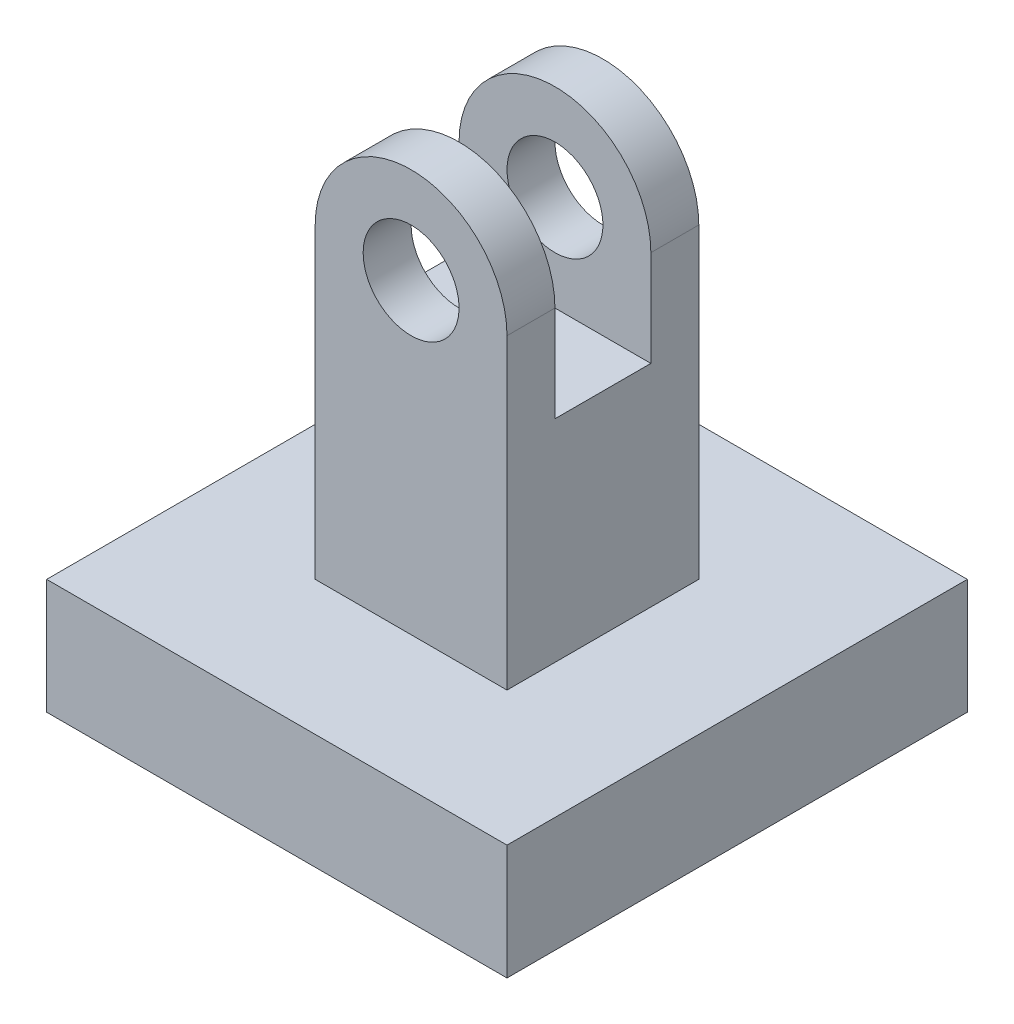
ISO-10303-21;
HEADER;
FILE_DESCRIPTION(('STEP AP214'),'2;1');
FILE_NAME('part.step','',(''),(''),'','','');
FILE_SCHEMA(('AUTOMOTIVE_DESIGN { 1 0 10303 214 1 1 1 1 }'));
ENDSEC;
DATA;
#1=APPLICATION_CONTEXT('core data for automotive mechanical design processes');
#2=APPLICATION_PROTOCOL_DEFINITION('international standard','automotive_design',2000,#1);
#3=PRODUCT_CONTEXT('',#1,'mechanical');
#4=PRODUCT('Part','Part','',(#3));
#5=PRODUCT_RELATED_PRODUCT_CATEGORY('part','',(#4));
#6=PRODUCT_DEFINITION_FORMATION('','',#4);
#7=PRODUCT_DEFINITION_CONTEXT('part definition',#1,'design');
#8=PRODUCT_DEFINITION('design','',#6,#7);
#9=PRODUCT_DEFINITION_SHAPE('','',#8);
#10=(LENGTH_UNIT() NAMED_UNIT(*) SI_UNIT(.MILLI.,.METRE.));
#11=(NAMED_UNIT(*) PLANE_ANGLE_UNIT() SI_UNIT($,.RADIAN.));
#12=(NAMED_UNIT(*) SI_UNIT($,.STERADIAN.) SOLID_ANGLE_UNIT());
#13=UNCERTAINTY_MEASURE_WITH_UNIT(LENGTH_MEASURE(1.E-05),#10,'distance_accuracy_value','');
#14=(GEOMETRIC_REPRESENTATION_CONTEXT(3) GLOBAL_UNCERTAINTY_ASSIGNED_CONTEXT((#13)) GLOBAL_UNIT_ASSIGNED_CONTEXT((#10,
#11,#12)) REPRESENTATION_CONTEXT('',''));
#15=CARTESIAN_POINT('',(0.,0.,0.));
#16=DIRECTION('',(0.,0.,1.));
#17=DIRECTION('',(1.,0.,0.));
#18=AXIS2_PLACEMENT_3D('',#15,#16,#17);
#19=CARTESIAN_POINT('',(-12.5,55.,0.));
#20=DIRECTION('',(-1.,0.,0.));
#21=DIRECTION('',(0.,0.,1.));
#22=AXIS2_PLACEMENT_3D('',#19,#20,#21);
#23=PLANE('',#22);
#24=DIRECTION('',(0.,0.,-1.));
#25=VECTOR('',#24,1.);
#26=CARTESIAN_POINT('',(-12.5,55.,0.));
#27=LINE('',#26,#25);
#28=CARTESIAN_POINT('',(-12.5,55.,12.5));
#29=VERTEX_POINT('',#28);
#30=CARTESIAN_POINT('',(-12.5,55.,6.25));
#31=VERTEX_POINT('',#30);
#32=EDGE_CURVE('E186',#29,#31,#27,.T.);
#33=ORIENTED_EDGE('',*,*,#32,.T.);
#34=DIRECTION('',(0.,-1.,0.));
#35=VECTOR('',#34,1.);
#36=CARTESIAN_POINT('',(-12.5,42.5,6.25));
#37=LINE('',#36,#35);
#38=CARTESIAN_POINT('',(-12.5,42.5,6.25));
#39=VERTEX_POINT('',#38);
#40=EDGE_CURVE('E163',#31,#39,#37,.T.);
#41=ORIENTED_EDGE('',*,*,#40,.T.);
#42=DIRECTION('',(0.,0.,-1.));
#43=VECTOR('',#42,1.);
#44=CARTESIAN_POINT('',(-12.5,42.5,6.25));
#45=LINE('',#44,#43);
#46=CARTESIAN_POINT('',(-12.5,42.5,-6.25));
#47=VERTEX_POINT('',#46);
#48=EDGE_CURVE('E154',#39,#47,#45,.T.);
#49=ORIENTED_EDGE('',*,*,#48,.T.);
#50=DIRECTION('',(0.,-1.,0.));
#51=VECTOR('',#50,1.);
#52=CARTESIAN_POINT('',(-12.5,42.5,-6.25));
#53=LINE('',#52,#51);
#54=CARTESIAN_POINT('',(-12.5,55.,-6.25));
#55=VERTEX_POINT('',#54);
#56=EDGE_CURVE('E140',#55,#47,#53,.T.);
#57=ORIENTED_EDGE('',*,*,#56,.F.);
#58=CARTESIAN_POINT('',(-12.5,55.,-12.5));
#59=VERTEX_POINT('',#58);
#60=EDGE_CURVE('E189',#55,#59,#27,.T.);
#61=ORIENTED_EDGE('',*,*,#60,.T.);
#62=DIRECTION('',(0.,-1.,0.));
#63=VECTOR('',#62,1.);
#64=CARTESIAN_POINT('',(-12.5,55.,-12.5));
#65=LINE('',#64,#63);
#66=CARTESIAN_POINT('',(-12.5,15.,-12.5));
#67=VERTEX_POINT('',#66);
#68=EDGE_CURVE('E193',#59,#67,#65,.T.);
#69=ORIENTED_EDGE('',*,*,#68,.T.);
#70=DIRECTION('',(0.,0.,-1.));
#71=VECTOR('',#70,1.);
#72=CARTESIAN_POINT('',(-12.5,15.,0.));
#73=LINE('',#72,#71);
#74=CARTESIAN_POINT('',(-12.5,15.,12.5));
#75=VERTEX_POINT('',#74);
#76=EDGE_CURVE('E56',#75,#67,#73,.T.);
#77=ORIENTED_EDGE('',*,*,#76,.F.);
#78=DIRECTION('',(0.,-1.,0.));
#79=VECTOR('',#78,1.);
#80=CARTESIAN_POINT('',(-12.5,55.,12.5));
#81=LINE('',#80,#79);
#82=EDGE_CURVE('E204',#29,#75,#81,.T.);
#83=ORIENTED_EDGE('',*,*,#82,.F.);
#84=EDGE_LOOP('',(#33,#41,#49,#57,#61,#69,#77,#83));
#85=FACE_BOUND('',#84,.T.);
#86=ADVANCED_FACE('F39',(#85),#23,.T.);
#87=CARTESIAN_POINT('',(12.5,55.,0.));
#88=DIRECTION('',(1.,0.,0.));
#89=DIRECTION('',(0.,0.,-1.));
#90=AXIS2_PLACEMENT_3D('',#87,#88,#89);
#91=PLANE('',#90);
#92=DIRECTION('',(0.,0.,-1.));
#93=VECTOR('',#92,1.);
#94=CARTESIAN_POINT('',(12.5,42.5,6.25));
#95=LINE('',#94,#93);
#96=CARTESIAN_POINT('',(12.5,42.5,6.25));
#97=VERTEX_POINT('',#96);
#98=CARTESIAN_POINT('',(12.5,42.5,-6.25));
#99=VERTEX_POINT('',#98);
#100=EDGE_CURVE('E157',#97,#99,#95,.T.);
#101=ORIENTED_EDGE('',*,*,#100,.F.);
#102=DIRECTION('',(0.,1.,0.));
#103=VECTOR('',#102,1.);
#104=CARTESIAN_POINT('',(12.5,42.5,6.25));
#105=LINE('',#104,#103);
#106=CARTESIAN_POINT('',(12.5,55.,6.25));
#107=VERTEX_POINT('',#106);
#108=EDGE_CURVE('E158',#97,#107,#105,.T.);
#109=ORIENTED_EDGE('',*,*,#108,.T.);
#110=DIRECTION('',(0.,0.,1.));
#111=VECTOR('',#110,1.);
#112=CARTESIAN_POINT('',(12.5,55.,0.));
#113=LINE('',#112,#111);
#114=CARTESIAN_POINT('',(12.5,55.,12.5));
#115=VERTEX_POINT('',#114);
#116=EDGE_CURVE('E188',#107,#115,#113,.T.);
#117=ORIENTED_EDGE('',*,*,#116,.T.);
#118=DIRECTION('',(0.,-1.,0.));
#119=VECTOR('',#118,1.);
#120=CARTESIAN_POINT('',(12.5,55.,12.5));
#121=LINE('',#120,#119);
#122=CARTESIAN_POINT('',(12.5,15.,12.5));
#123=VERTEX_POINT('',#122);
#124=EDGE_CURVE('E207',#115,#123,#121,.T.);
#125=ORIENTED_EDGE('',*,*,#124,.T.);
#126=DIRECTION('',(0.,0.,1.));
#127=VECTOR('',#126,1.);
#128=CARTESIAN_POINT('',(12.5,15.,0.));
#129=LINE('',#128,#127);
#130=CARTESIAN_POINT('',(12.5,15.,-12.5));
#131=VERTEX_POINT('',#130);
#132=EDGE_CURVE('E198',#131,#123,#129,.T.);
#133=ORIENTED_EDGE('',*,*,#132,.F.);
#134=DIRECTION('',(0.,-1.,0.));
#135=VECTOR('',#134,1.);
#136=CARTESIAN_POINT('',(12.5,55.,-12.5));
#137=LINE('',#136,#135);
#138=CARTESIAN_POINT('',(12.5,55.,-12.5));
#139=VERTEX_POINT('',#138);
#140=EDGE_CURVE('E209',#139,#131,#137,.T.);
#141=ORIENTED_EDGE('',*,*,#140,.F.);
#142=CARTESIAN_POINT('',(12.5,55.,-6.25));
#143=VERTEX_POINT('',#142);
#144=EDGE_CURVE('E190',#139,#143,#113,.T.);
#145=ORIENTED_EDGE('',*,*,#144,.T.);
#146=DIRECTION('',(0.,1.,0.));
#147=VECTOR('',#146,1.);
#148=CARTESIAN_POINT('',(12.5,42.5,-6.25));
#149=LINE('',#148,#147);
#150=EDGE_CURVE('E150',#99,#143,#149,.T.);
#151=ORIENTED_EDGE('',*,*,#150,.F.);
#152=EDGE_LOOP('',(#101,#109,#117,#125,#133,#141,#145,#151));
#153=FACE_BOUND('',#152,.T.);
#154=ADVANCED_FACE('F253',(#153),#91,.T.);
#155=CARTESIAN_POINT('',(0.,55.,-40.4508497187474));
#156=DIRECTION('',(0.,0.,1.));
#157=DIRECTION('',(1.,0.,0.));
#158=AXIS2_PLACEMENT_3D('',#155,#156,#157);
#159=CYLINDRICAL_SURFACE('',#158,12.5);
#160=ORIENTED_EDGE('',*,*,#116,.F.);
#161=CARTESIAN_POINT('',(0.,55.,6.25));
#162=DIRECTION('',(0.,0.,-1.));
#163=DIRECTION('',(-1.,0.,0.));
#164=AXIS2_PLACEMENT_3D('',#161,#162,#163);
#165=CIRCLE('',#164,12.5);
#166=EDGE_CURVE('E172',#107,#31,#165,.F.);
#167=ORIENTED_EDGE('',*,*,#166,.T.);
#168=ORIENTED_EDGE('',*,*,#32,.F.);
#169=CARTESIAN_POINT('',(0.,55.,12.5));
#170=DIRECTION('',(0.,0.,1.));
#171=DIRECTION('',(1.,0.,0.));
#172=AXIS2_PLACEMENT_3D('',#169,#170,#171);
#173=CIRCLE('',#172,12.5);
#174=EDGE_CURVE('E181',#115,#29,#173,.T.);
#175=ORIENTED_EDGE('',*,*,#174,.F.);
#176=EDGE_LOOP('',(#160,#167,#168,#175));
#177=FACE_BOUND('',#176,.T.);
#178=ADVANCED_FACE('F258',(#177),#159,.T.);
#179=CARTESIAN_POINT('',(0.,55.,30.1776695296637));
#180=DIRECTION('',(0.,0.,-1.));
#181=DIRECTION('',(-1.,0.,0.));
#182=AXIS2_PLACEMENT_3D('',#179,#180,#181);
#183=CYLINDRICAL_SURFACE('',#182,6.25);
#184=CARTESIAN_POINT('',(0.,55.,12.5));
#185=DIRECTION('',(0.,0.,1.));
#186=DIRECTION('',(1.,0.,0.));
#187=AXIS2_PLACEMENT_3D('',#184,#185,#186);
#188=CIRCLE('',#187,6.25);
#189=CARTESIAN_POINT('',(-6.25,55.,12.5));
#190=VERTEX_POINT('',#189);
#191=EDGE_CURVE('E177',#190,#190,#188,.F.);
#192=CARTESIAN_POINT('',(0.,55.,6.25));
#193=DIRECTION('',(0.,0.,-1.));
#194=DIRECTION('',(-1.,0.,0.));
#195=AXIS2_PLACEMENT_3D('',#192,#193,#194);
#196=CIRCLE('',#195,6.25);
#197=CARTESIAN_POINT('',(-6.25,55.,6.25000000000001));
#198=VERTEX_POINT('',#197);
#199=EDGE_CURVE('E43',#198,#198,#196,.F.);
#200=CARTESIAN_POINT('',(-6.25,55.,12.5));
#201=CARTESIAN_POINT('',(-6.25,55.,12.4348958333333));
#202=CARTESIAN_POINT('',(-6.25,55.,12.3697916666667));
#203=CARTESIAN_POINT('',(-6.25,55.,12.2395833333333));
#204=CARTESIAN_POINT('',(-6.25,55.,12.1744791666667));
#205=CARTESIAN_POINT('',(-6.25,55.,12.0442708333333));
#206=CARTESIAN_POINT('',(-6.25,55.,11.9791666666667));
#207=CARTESIAN_POINT('',(-6.25,55.,11.8489583333333));
#208=CARTESIAN_POINT('',(-6.25,55.,11.7838541666667));
#209=CARTESIAN_POINT('',(-6.25,55.,11.6536458333333));
#210=CARTESIAN_POINT('',(-6.25,55.,11.5885416666667));
#211=CARTESIAN_POINT('',(-6.25,55.,11.4583333333333));
#212=CARTESIAN_POINT('',(-6.25,55.,11.3932291666667));
#213=CARTESIAN_POINT('',(-6.25,55.,11.2630208333333));
#214=CARTESIAN_POINT('',(-6.25,55.,11.1979166666667));
#215=CARTESIAN_POINT('',(-6.25,55.,11.0677083333333));
#216=CARTESIAN_POINT('',(-6.25,55.,11.0026041666667));
#217=CARTESIAN_POINT('',(-6.25,55.,10.8723958333333));
#218=CARTESIAN_POINT('',(-6.25,55.,10.8072916666667));
#219=CARTESIAN_POINT('',(-6.25,55.,10.6770833333333));
#220=CARTESIAN_POINT('',(-6.25,55.,10.6119791666667));
#221=CARTESIAN_POINT('',(-6.25,55.,10.4817708333333));
#222=CARTESIAN_POINT('',(-6.25,55.,10.4166666666667));
#223=CARTESIAN_POINT('',(-6.25,55.,10.2864583333333));
#224=CARTESIAN_POINT('',(-6.25,55.,10.2213541666667));
#225=CARTESIAN_POINT('',(-6.25,55.,10.0911458333333));
#226=CARTESIAN_POINT('',(-6.25,55.,10.0260416666667));
#227=CARTESIAN_POINT('',(-6.25,55.,9.89583333333333));
#228=CARTESIAN_POINT('',(-6.25,55.,9.83072916666667));
#229=CARTESIAN_POINT('',(-6.25,55.,9.70052083333333));
#230=CARTESIAN_POINT('',(-6.25,55.,9.63541666666667));
#231=CARTESIAN_POINT('',(-6.25,55.,9.50520833333333));
#232=CARTESIAN_POINT('',(-6.25,55.,9.44010416666667));
#233=CARTESIAN_POINT('',(-6.25,55.,9.30989583333334));
#234=CARTESIAN_POINT('',(-6.25,55.,9.24479166666667));
#235=CARTESIAN_POINT('',(-6.25,55.,9.11458333333334));
#236=CARTESIAN_POINT('',(-6.25,55.,9.04947916666667));
#237=CARTESIAN_POINT('',(-6.25,55.,8.91927083333334));
#238=CARTESIAN_POINT('',(-6.25,55.,8.85416666666667));
#239=CARTESIAN_POINT('',(-6.25,55.,8.72395833333334));
#240=CARTESIAN_POINT('',(-6.25,55.,8.65885416666667));
#241=CARTESIAN_POINT('',(-6.25,55.,8.52864583333334));
#242=CARTESIAN_POINT('',(-6.25,55.,8.46354166666667));
#243=CARTESIAN_POINT('',(-6.25,55.,8.33333333333334));
#244=CARTESIAN_POINT('',(-6.25,55.,8.26822916666667));
#245=CARTESIAN_POINT('',(-6.25,55.,8.13802083333334));
#246=CARTESIAN_POINT('',(-6.25,55.,8.07291666666667));
#247=CARTESIAN_POINT('',(-6.25,55.,7.94270833333334));
#248=CARTESIAN_POINT('',(-6.25,55.,7.87760416666667));
#249=CARTESIAN_POINT('',(-6.25,55.,7.74739583333334));
#250=CARTESIAN_POINT('',(-6.25,55.,7.68229166666667));
#251=CARTESIAN_POINT('',(-6.25,55.,7.55208333333334));
#252=CARTESIAN_POINT('',(-6.25,55.,7.48697916666667));
#253=CARTESIAN_POINT('',(-6.25,55.,7.35677083333334));
#254=CARTESIAN_POINT('',(-6.25,55.,7.29166666666667));
#255=CARTESIAN_POINT('',(-6.25,55.,7.16145833333334));
#256=CARTESIAN_POINT('',(-6.25,55.,7.09635416666667));
#257=CARTESIAN_POINT('',(-6.25,55.,6.96614583333334));
#258=CARTESIAN_POINT('',(-6.25,55.,6.90104166666667));
#259=CARTESIAN_POINT('',(-6.25,55.,6.77083333333334));
#260=CARTESIAN_POINT('',(-6.25,55.,6.70572916666667));
#261=CARTESIAN_POINT('',(-6.25,55.,6.57552083333334));
#262=CARTESIAN_POINT('',(-6.25,55.,6.51041666666667));
#263=CARTESIAN_POINT('',(-6.25,55.,6.38020833333334));
#264=CARTESIAN_POINT('',(-6.25,55.,6.31510416666667));
#265=CARTESIAN_POINT('',(-6.25,55.,6.25000000000001));
#266=B_SPLINE_CURVE_WITH_KNOTS('',3,(#200,#201,#202,#203,#204,#205,#206,#207,#208,#209,#210,
#211,#212,#213,#214,#215,#216,#217,#218,#219,#220,#221,#222,#223,#224,#225,#226,#227,#228,#229,
#230,#231,#232,#233,#234,#235,#236,#237,#238,#239,#240,#241,#242,#243,#244,#245,#246,#247,#248,
#249,#250,#251,#252,#253,#254,#255,#256,#257,#258,#259,#260,#261,#262,#263,#264,#265),
.UNSPECIFIED.,.F.,.F.,(4,2,2,2,2,2,2,2,2,2,2,2,2,2,2,2,2,2,2,2,2,2,2,2,2,2,2,2,2,2,2,2,4),(0.,
0.195312499999999,0.390624999999999,0.585937499999998,0.781249999999997,0.9765625,1.171875,
1.3671875,1.5625,1.7578125,1.953125,2.1484375,2.34375,2.5390625,2.734375,2.9296875,3.125,
3.3203125,3.51562499999999,3.71093749999999,3.90624999999999,4.1015625,4.296875,
4.49218749999999,4.68749999999999,4.88281249999999,5.07812499999999,5.27343749999999,
5.46874999999999,5.66406249999999,5.85937499999999,6.05468749999999,6.24999999999999),.UNSPECIFIED.);
#267=EDGE_CURVE('BSEAM266',#190,#198,#266,.T.);
#268=ORIENTED_EDGE('',*,*,#191,.F.);
#269=ORIENTED_EDGE('',*,*,#199,.F.);
#270=ORIENTED_EDGE('',*,*,#267,.T.);
#271=ORIENTED_EDGE('',*,*,#267,.F.);
#272=EDGE_LOOP('',(#268,#270,#269,#271));
#273=FACE_BOUND('',#272,.T.);
#274=ADVANCED_FACE('F266',(#273),#183,.F.);
#275=CARTESIAN_POINT('',(0.,15.,0.));
#276=DIRECTION('',(0.,1.,0.));
#277=DIRECTION('',(0.,0.,1.));
#278=AXIS2_PLACEMENT_3D('',#275,#276,#277);
#279=PLANE('',#278);
#280=DIRECTION('',(0.,0.,-1.));
#281=VECTOR('',#280,1.);
#282=CARTESIAN_POINT('',(30.,15.,-30.));
#283=LINE('',#282,#281);
#284=CARTESIAN_POINT('',(30.,15.,30.));
#285=VERTEX_POINT('',#284);
#286=CARTESIAN_POINT('',(30.,15.,-30.));
#287=VERTEX_POINT('',#286);
#288=EDGE_CURVE('E212',#285,#287,#283,.T.);
#289=ORIENTED_EDGE('',*,*,#288,.T.);
#290=DIRECTION('',(-1.,0.,0.));
#291=VECTOR('',#290,1.);
#292=CARTESIAN_POINT('',(-30.,15.,-30.));
#293=LINE('',#292,#291);
#294=CARTESIAN_POINT('',(-30.,15.,-30.));
#295=VERTEX_POINT('',#294);
#296=EDGE_CURVE('E93',#287,#295,#293,.T.);
#297=ORIENTED_EDGE('',*,*,#296,.T.);
#298=DIRECTION('',(0.,0.,1.));
#299=VECTOR('',#298,1.);
#300=CARTESIAN_POINT('',(-30.,15.,-30.));
#301=LINE('',#300,#299);
#302=CARTESIAN_POINT('',(-30.,15.,30.));
#303=VERTEX_POINT('',#302);
#304=EDGE_CURVE('E215',#295,#303,#301,.T.);
#305=ORIENTED_EDGE('',*,*,#304,.T.);
#306=DIRECTION('',(1.,0.,0.));
#307=VECTOR('',#306,1.);
#308=CARTESIAN_POINT('',(-30.,15.,30.));
#309=LINE('',#308,#307);
#310=EDGE_CURVE('E65',#303,#285,#309,.T.);
#311=ORIENTED_EDGE('',*,*,#310,.T.);
#312=EDGE_LOOP('',(#289,#297,#305,#311));
#313=FACE_BOUND('',#312,.T.);
#314=DIRECTION('',(-1.,0.,0.));
#315=VECTOR('',#314,1.);
#316=CARTESIAN_POINT('',(0.,15.,12.5));
#317=LINE('',#316,#315);
#318=EDGE_CURVE('E201',#123,#75,#317,.T.);
#319=ORIENTED_EDGE('',*,*,#318,.T.);
#320=ORIENTED_EDGE('',*,*,#76,.T.);
#321=DIRECTION('',(1.,0.,0.));
#322=VECTOR('',#321,1.);
#323=CARTESIAN_POINT('',(0.,15.,-12.5));
#324=LINE('',#323,#322);
#325=EDGE_CURVE('E195',#67,#131,#324,.T.);
#326=ORIENTED_EDGE('',*,*,#325,.T.);
#327=ORIENTED_EDGE('',*,*,#132,.T.);
#328=EDGE_LOOP('',(#319,#320,#326,#327));
#329=FACE_BOUND('',#328,.T.);
#330=ADVANCED_FACE('F264',(#313,#329),#279,.T.);
#331=CARTESIAN_POINT('',(30.,15.,-30.));
#332=DIRECTION('',(-1.,0.,0.));
#333=DIRECTION('',(0.,0.,1.));
#334=AXIS2_PLACEMENT_3D('',#331,#332,#333);
#335=PLANE('',#334);
#336=DIRECTION('',(0.,0.,-1.));
#337=VECTOR('',#336,1.);
#338=CARTESIAN_POINT('',(30.,0.,-30.));
#339=LINE('',#338,#337);
#340=CARTESIAN_POINT('',(30.,0.,30.));
#341=VERTEX_POINT('',#340);
#342=CARTESIAN_POINT('',(30.,0.,-30.));
#343=VERTEX_POINT('',#342);
#344=EDGE_CURVE('E206',#341,#343,#339,.T.);
#345=ORIENTED_EDGE('',*,*,#344,.T.);
#346=DIRECTION('',(0.,-1.,0.));
#347=VECTOR('',#346,1.);
#348=CARTESIAN_POINT('',(30.,15.,-30.));
#349=LINE('',#348,#347);
#350=EDGE_CURVE('E11',#287,#343,#349,.T.);
#351=ORIENTED_EDGE('',*,*,#350,.F.);
#352=ORIENTED_EDGE('',*,*,#288,.F.);
#353=DIRECTION('',(0.,-1.,0.));
#354=VECTOR('',#353,1.);
#355=CARTESIAN_POINT('',(30.,15.,30.));
#356=LINE('',#355,#354);
#357=EDGE_CURVE('E218',#285,#341,#356,.T.);
#358=ORIENTED_EDGE('',*,*,#357,.T.);
#359=EDGE_LOOP('',(#345,#351,#352,#358));
#360=FACE_BOUND('',#359,.T.);
#361=ADVANCED_FACE('F41',(#360),#335,.F.);
#362=CARTESIAN_POINT('',(-30.,15.,-30.));
#363=DIRECTION('',(0.,0.,1.));
#364=DIRECTION('',(1.,0.,0.));
#365=AXIS2_PLACEMENT_3D('',#362,#363,#364);
#366=PLANE('',#365);
#367=DIRECTION('',(-1.,0.,0.));
#368=VECTOR('',#367,1.);
#369=CARTESIAN_POINT('',(-30.,0.,-30.));
#370=LINE('',#369,#368);
#371=CARTESIAN_POINT('',(-30.,0.,-30.));
#372=VERTEX_POINT('',#371);
#373=EDGE_CURVE('E221',#343,#372,#370,.T.);
#374=ORIENTED_EDGE('',*,*,#373,.T.);
#375=DIRECTION('',(0.,-1.,0.));
#376=VECTOR('',#375,1.);
#377=CARTESIAN_POINT('',(-30.,15.,-30.));
#378=LINE('',#377,#376);
#379=EDGE_CURVE('E48',#295,#372,#378,.T.);
#380=ORIENTED_EDGE('',*,*,#379,.F.);
#381=ORIENTED_EDGE('',*,*,#296,.F.);
#382=ORIENTED_EDGE('',*,*,#350,.T.);
#383=EDGE_LOOP('',(#374,#380,#381,#382));
#384=FACE_BOUND('',#383,.T.);
#385=ADVANCED_FACE('F250',(#384),#366,.F.);
#386=CARTESIAN_POINT('',(-30.,15.,-30.));
#387=DIRECTION('',(1.,0.,0.));
#388=DIRECTION('',(0.,0.,-1.));
#389=AXIS2_PLACEMENT_3D('',#386,#387,#388);
#390=PLANE('',#389);
#391=DIRECTION('',(0.,0.,1.));
#392=VECTOR('',#391,1.);
#393=CARTESIAN_POINT('',(-30.,0.,-30.));
#394=LINE('',#393,#392);
#395=CARTESIAN_POINT('',(-30.,0.,30.));
#396=VERTEX_POINT('',#395);
#397=EDGE_CURVE('E223',#372,#396,#394,.T.);
#398=ORIENTED_EDGE('',*,*,#397,.T.);
#399=DIRECTION('',(0.,-1.,0.));
#400=VECTOR('',#399,1.);
#401=CARTESIAN_POINT('',(-30.,15.,30.));
#402=LINE('',#401,#400);
#403=EDGE_CURVE('E227',#303,#396,#402,.T.);
#404=ORIENTED_EDGE('',*,*,#403,.F.);
#405=ORIENTED_EDGE('',*,*,#304,.F.);
#406=ORIENTED_EDGE('',*,*,#379,.T.);
#407=EDGE_LOOP('',(#398,#404,#405,#406));
#408=FACE_BOUND('',#407,.T.);
#409=ADVANCED_FACE('F233',(#408),#390,.F.);
#410=CARTESIAN_POINT('',(-30.,15.,30.));
#411=DIRECTION('',(0.,0.,-1.));
#412=DIRECTION('',(-1.,0.,0.));
#413=AXIS2_PLACEMENT_3D('',#410,#411,#412);
#414=PLANE('',#413);
#415=DIRECTION('',(1.,0.,0.));
#416=VECTOR('',#415,1.);
#417=CARTESIAN_POINT('',(-30.,0.,30.));
#418=LINE('',#417,#416);
#419=EDGE_CURVE('E86',#396,#341,#418,.T.);
#420=ORIENTED_EDGE('',*,*,#419,.T.);
#421=ORIENTED_EDGE('',*,*,#357,.F.);
#422=ORIENTED_EDGE('',*,*,#310,.F.);
#423=ORIENTED_EDGE('',*,*,#403,.T.);
#424=EDGE_LOOP('',(#420,#421,#422,#423));
#425=FACE_BOUND('',#424,.T.);
#426=ADVANCED_FACE('F241',(#425),#414,.F.);
#427=CARTESIAN_POINT('',(0.,0.,0.));
#428=DIRECTION('',(0.,1.,0.));
#429=DIRECTION('',(0.,0.,1.));
#430=AXIS2_PLACEMENT_3D('',#427,#428,#429);
#431=PLANE('',#430);
#432=ORIENTED_EDGE('',*,*,#344,.F.);
#433=ORIENTED_EDGE('',*,*,#419,.F.);
#434=ORIENTED_EDGE('',*,*,#397,.F.);
#435=ORIENTED_EDGE('',*,*,#373,.F.);
#436=EDGE_LOOP('',(#432,#433,#434,#435));
#437=FACE_BOUND('',#436,.T.);
#438=ADVANCED_FACE('F237',(#437),#431,.F.);
#439=CARTESIAN_POINT('',(0.,55.,12.5));
#440=DIRECTION('',(0.,0.,1.));
#441=DIRECTION('',(1.,0.,0.));
#442=AXIS2_PLACEMENT_3D('',#439,#440,#441);
#443=PLANE('',#442);
#444=ORIENTED_EDGE('',*,*,#191,.T.);
#445=EDGE_LOOP('',(#444));
#446=FACE_BOUND('',#445,.T.);
#447=ORIENTED_EDGE('',*,*,#318,.F.);
#448=ORIENTED_EDGE('',*,*,#124,.F.);
#449=ORIENTED_EDGE('',*,*,#174,.T.);
#450=ORIENTED_EDGE('',*,*,#82,.T.);
#451=EDGE_LOOP('',(#447,#448,#449,#450));
#452=FACE_BOUND('',#451,.T.);
#453=ADVANCED_FACE('F248',(#446,#452),#443,.T.);
#454=CARTESIAN_POINT('',(0.,55.,-12.5));
#455=DIRECTION('',(0.,0.,-1.));
#456=DIRECTION('',(-1.,0.,0.));
#457=AXIS2_PLACEMENT_3D('',#454,#455,#456);
#458=PLANE('',#457);
#459=CARTESIAN_POINT('',(0.,55.,-12.5));
#460=DIRECTION('',(0.,0.,-1.));
#461=DIRECTION('',(-1.,0.,0.));
#462=AXIS2_PLACEMENT_3D('',#459,#460,#461);
#463=CIRCLE('',#462,6.25);
#464=CARTESIAN_POINT('',(-6.25,55.,-12.5));
#465=VERTEX_POINT('',#464);
#466=EDGE_CURVE('E174',#465,#465,#463,.T.);
#467=ORIENTED_EDGE('',*,*,#466,.F.);
#468=EDGE_LOOP('',(#467));
#469=FACE_BOUND('',#468,.T.);
#470=ORIENTED_EDGE('',*,*,#325,.F.);
#471=ORIENTED_EDGE('',*,*,#68,.F.);
#472=CARTESIAN_POINT('',(0.,55.,-12.5));
#473=DIRECTION('',(0.,0.,-1.));
#474=DIRECTION('',(-1.,0.,0.));
#475=AXIS2_PLACEMENT_3D('',#472,#473,#474);
#476=CIRCLE('',#475,12.5);
#477=EDGE_CURVE('E180',#139,#59,#476,.F.);
#478=ORIENTED_EDGE('',*,*,#477,.F.);
#479=ORIENTED_EDGE('',*,*,#140,.T.);
#480=EDGE_LOOP('',(#470,#471,#478,#479));
#481=FACE_BOUND('',#480,.T.);
#482=ADVANCED_FACE('F263',(#469,#481),#458,.T.);
#483=CARTESIAN_POINT('',(0.,55.,-6.25));
#484=DIRECTION('',(0.,0.,-1.));
#485=DIRECTION('',(-1.,0.,0.));
#486=AXIS2_PLACEMENT_3D('',#483,#484,#485);
#487=CIRCLE('',#486,12.5);
#488=EDGE_CURVE('E147',#143,#55,#487,.F.);
#489=ORIENTED_EDGE('',*,*,#488,.F.);
#490=ORIENTED_EDGE('',*,*,#144,.F.);
#491=ORIENTED_EDGE('',*,*,#477,.T.);
#492=ORIENTED_EDGE('',*,*,#60,.F.);
#493=EDGE_LOOP('',(#489,#490,#491,#492));
#494=FACE_BOUND('',#493,.T.);
#495=ADVANCED_FACE('F292',(#494),#159,.T.);
#496=CARTESIAN_POINT('',(0.,55.,-6.25));
#497=DIRECTION('',(0.,0.,-1.));
#498=DIRECTION('',(-1.,0.,0.));
#499=AXIS2_PLACEMENT_3D('',#496,#497,#498);
#500=CIRCLE('',#499,6.25);
#501=CARTESIAN_POINT('',(-6.25,55.,-6.25));
#502=VERTEX_POINT('',#501);
#503=EDGE_CURVE('E164',#502,#502,#500,.F.);
#504=CARTESIAN_POINT('',(-6.25,55.,-6.25));
#505=CARTESIAN_POINT('',(-6.25,55.,-6.31510416666666));
#506=CARTESIAN_POINT('',(-6.25,55.,-6.38020833333333));
#507=CARTESIAN_POINT('',(-6.25,55.,-6.51041666666666));
#508=CARTESIAN_POINT('',(-6.25,55.,-6.57552083333333));
#509=CARTESIAN_POINT('',(-6.25,55.,-6.70572916666666));
#510=CARTESIAN_POINT('',(-6.25,55.,-6.77083333333333));
#511=CARTESIAN_POINT('',(-6.25,55.,-6.90104166666666));
#512=CARTESIAN_POINT('',(-6.25,55.,-6.96614583333333));
#513=CARTESIAN_POINT('',(-6.25,55.,-7.09635416666666));
#514=CARTESIAN_POINT('',(-6.25,55.,-7.16145833333333));
#515=CARTESIAN_POINT('',(-6.25,55.,-7.29166666666666));
#516=CARTESIAN_POINT('',(-6.25,55.,-7.35677083333333));
#517=CARTESIAN_POINT('',(-6.25,55.,-7.48697916666666));
#518=CARTESIAN_POINT('',(-6.25,55.,-7.55208333333333));
#519=CARTESIAN_POINT('',(-6.25,55.,-7.68229166666666));
#520=CARTESIAN_POINT('',(-6.25,55.,-7.74739583333333));
#521=CARTESIAN_POINT('',(-6.25,55.,-7.87760416666666));
#522=CARTESIAN_POINT('',(-6.25,55.,-7.94270833333333));
#523=CARTESIAN_POINT('',(-6.25,55.,-8.07291666666666));
#524=CARTESIAN_POINT('',(-6.25,55.,-8.13802083333333));
#525=CARTESIAN_POINT('',(-6.25,55.,-8.26822916666666));
#526=CARTESIAN_POINT('',(-6.25,55.,-8.33333333333333));
#527=CARTESIAN_POINT('',(-6.25,55.,-8.46354166666667));
#528=CARTESIAN_POINT('',(-6.25,55.,-8.52864583333333));
#529=CARTESIAN_POINT('',(-6.25,55.,-8.65885416666667));
#530=CARTESIAN_POINT('',(-6.25,55.,-8.72395833333333));
#531=CARTESIAN_POINT('',(-6.25,55.,-8.85416666666666));
#532=CARTESIAN_POINT('',(-6.25,55.,-8.91927083333333));
#533=CARTESIAN_POINT('',(-6.25,55.,-9.04947916666666));
#534=CARTESIAN_POINT('',(-6.25,55.,-9.11458333333333));
#535=CARTESIAN_POINT('',(-6.25,55.,-9.24479166666666));
#536=CARTESIAN_POINT('',(-6.25,55.,-9.30989583333333));
#537=CARTESIAN_POINT('',(-6.25,55.,-9.44010416666667));
#538=CARTESIAN_POINT('',(-6.25,55.,-9.50520833333333));
#539=CARTESIAN_POINT('',(-6.25,55.,-9.63541666666667));
#540=CARTESIAN_POINT('',(-6.25,55.,-9.70052083333333));
#541=CARTESIAN_POINT('',(-6.25,55.,-9.83072916666666));
#542=CARTESIAN_POINT('',(-6.25,55.,-9.89583333333333));
#543=CARTESIAN_POINT('',(-6.25,55.,-10.0260416666667));
#544=CARTESIAN_POINT('',(-6.25,55.,-10.0911458333333));
#545=CARTESIAN_POINT('',(-6.25,55.,-10.2213541666667));
#546=CARTESIAN_POINT('',(-6.25,55.,-10.2864583333333));
#547=CARTESIAN_POINT('',(-6.25,55.,-10.4166666666667));
#548=CARTESIAN_POINT('',(-6.25,55.,-10.4817708333333));
#549=CARTESIAN_POINT('',(-6.25,55.,-10.6119791666667));
#550=CARTESIAN_POINT('',(-6.25,55.,-10.6770833333333));
#551=CARTESIAN_POINT('',(-6.25,55.,-10.8072916666667));
#552=CARTESIAN_POINT('',(-6.25,55.,-10.8723958333333));
#553=CARTESIAN_POINT('',(-6.25,55.,-11.0026041666667));
#554=CARTESIAN_POINT('',(-6.25,55.,-11.0677083333333));
#555=CARTESIAN_POINT('',(-6.25,55.,-11.1979166666667));
#556=CARTESIAN_POINT('',(-6.25,55.,-11.2630208333333));
#557=CARTESIAN_POINT('',(-6.25,55.,-11.3932291666667));
#558=CARTESIAN_POINT('',(-6.25,55.,-11.4583333333333));
#559=CARTESIAN_POINT('',(-6.25,55.,-11.5885416666667));
#560=CARTESIAN_POINT('',(-6.25,55.,-11.6536458333333));
#561=CARTESIAN_POINT('',(-6.25,55.,-11.7838541666667));
#562=CARTESIAN_POINT('',(-6.25,55.,-11.8489583333333));
#563=CARTESIAN_POINT('',(-6.25,55.,-11.9791666666667));
#564=CARTESIAN_POINT('',(-6.25,55.,-12.0442708333333));
#565=CARTESIAN_POINT('',(-6.25,55.,-12.1744791666667));
#566=CARTESIAN_POINT('',(-6.25,55.,-12.2395833333333));
#567=CARTESIAN_POINT('',(-6.25,55.,-12.3697916666667));
#568=CARTESIAN_POINT('',(-6.25,55.,-12.4348958333333));
#569=CARTESIAN_POINT('',(-6.25,55.,-12.5));
#570=B_SPLINE_CURVE_WITH_KNOTS('',3,(#504,#505,#506,#507,#508,#509,#510,#511,#512,#513,#514,
#515,#516,#517,#518,#519,#520,#521,#522,#523,#524,#525,#526,#527,#528,#529,#530,#531,#532,#533,
#534,#535,#536,#537,#538,#539,#540,#541,#542,#543,#544,#545,#546,#547,#548,#549,#550,#551,#552,
#553,#554,#555,#556,#557,#558,#559,#560,#561,#562,#563,#564,#565,#566,#567,#568,#569),
.UNSPECIFIED.,.F.,.F.,(4,2,2,2,2,2,2,2,2,2,2,2,2,2,2,2,2,2,2,2,2,2,2,2,2,2,2,2,2,2,2,2,4),(0.,
0.195312500000003,0.390624999999999,0.585937500000001,0.781249999999997,0.9765625,1.171875,
1.3671875,1.5625,1.7578125,1.953125,2.1484375,2.34375000000001,2.5390625,2.734375,2.9296875,
3.125,3.32031250000001,3.515625,3.7109375,3.90625,4.1015625,4.29687500000001,4.4921875,4.6875,
4.88281250000001,5.078125,5.27343750000001,5.46875000000001,5.6640625,5.85937500000001,
6.0546875,6.25000000000001),.UNSPECIFIED.);
#571=EDGE_CURVE('BSEAM273',#502,#465,#570,.T.);
#572=ORIENTED_EDGE('',*,*,#503,.T.);
#573=ORIENTED_EDGE('',*,*,#466,.T.);
#574=ORIENTED_EDGE('',*,*,#571,.T.);
#575=ORIENTED_EDGE('',*,*,#571,.F.);
#576=EDGE_LOOP('',(#572,#574,#573,#575));
#577=FACE_BOUND('',#576,.T.);
#578=ADVANCED_FACE('F273',(#577),#183,.F.);
#579=CARTESIAN_POINT('',(0.,0.,6.25));
#580=DIRECTION('',(0.,0.,-1.));
#581=DIRECTION('',(-1.,0.,0.));
#582=AXIS2_PLACEMENT_3D('',#579,#580,#581);
#583=PLANE('',#582);
#584=ORIENTED_EDGE('',*,*,#108,.F.);
#585=DIRECTION('',(1.,0.,0.));
#586=VECTOR('',#585,1.);
#587=CARTESIAN_POINT('',(-12.5,42.5,6.25));
#588=LINE('',#587,#586);
#589=EDGE_CURVE('E167',#39,#97,#588,.T.);
#590=ORIENTED_EDGE('',*,*,#589,.F.);
#591=ORIENTED_EDGE('',*,*,#40,.F.);
#592=ORIENTED_EDGE('',*,*,#166,.F.);
#593=EDGE_LOOP('',(#584,#590,#591,#592));
#594=FACE_BOUND('',#593,.T.);
#595=ORIENTED_EDGE('',*,*,#199,.T.);
#596=EDGE_LOOP('',(#595));
#597=FACE_BOUND('',#596,.T.);
#598=ADVANCED_FACE('F285',(#594,#597),#583,.T.);
#599=CARTESIAN_POINT('',(0.,0.,-6.25));
#600=DIRECTION('',(0.,0.,-1.));
#601=DIRECTION('',(-1.,0.,0.));
#602=AXIS2_PLACEMENT_3D('',#599,#600,#601);
#603=PLANE('',#602);
#604=ORIENTED_EDGE('',*,*,#488,.T.);
#605=ORIENTED_EDGE('',*,*,#56,.T.);
#606=DIRECTION('',(1.,0.,0.));
#607=VECTOR('',#606,1.);
#608=CARTESIAN_POINT('',(-12.5,42.5,-6.25));
#609=LINE('',#608,#607);
#610=EDGE_CURVE('E144',#47,#99,#609,.T.);
#611=ORIENTED_EDGE('',*,*,#610,.T.);
#612=ORIENTED_EDGE('',*,*,#150,.T.);
#613=EDGE_LOOP('',(#604,#605,#611,#612));
#614=FACE_BOUND('',#613,.T.);
#615=ORIENTED_EDGE('',*,*,#503,.F.);
#616=EDGE_LOOP('',(#615));
#617=FACE_BOUND('',#616,.T.);
#618=ADVANCED_FACE('F142',(#614,#617),#603,.F.);
#619=CARTESIAN_POINT('',(-12.5,42.5,6.25));
#620=DIRECTION('',(0.,1.,0.));
#621=DIRECTION('',(0.,0.,1.));
#622=AXIS2_PLACEMENT_3D('',#619,#620,#621);
#623=PLANE('',#622);
#624=ORIENTED_EDGE('',*,*,#48,.F.);
#625=ORIENTED_EDGE('',*,*,#589,.T.);
#626=ORIENTED_EDGE('',*,*,#100,.T.);
#627=ORIENTED_EDGE('',*,*,#610,.F.);
#628=EDGE_LOOP('',(#624,#625,#626,#627));
#629=FACE_BOUND('',#628,.T.);
#630=ADVANCED_FACE('F153',(#629),#623,.T.);
#631=CLOSED_SHELL('',(#86,#154,#178,#274,#330,#361,#385,#409,#426,#438,#453,#482,#495,#578,#598,
#618,#630));
#632=MANIFOLD_SOLID_BREP('B2',#631);
#633=ADVANCED_BREP_SHAPE_REPRESENTATION('',(#18,#632),#14);
#634=SHAPE_DEFINITION_REPRESENTATION(#9,#633);
ENDSEC;
END-ISO-10303-21;
